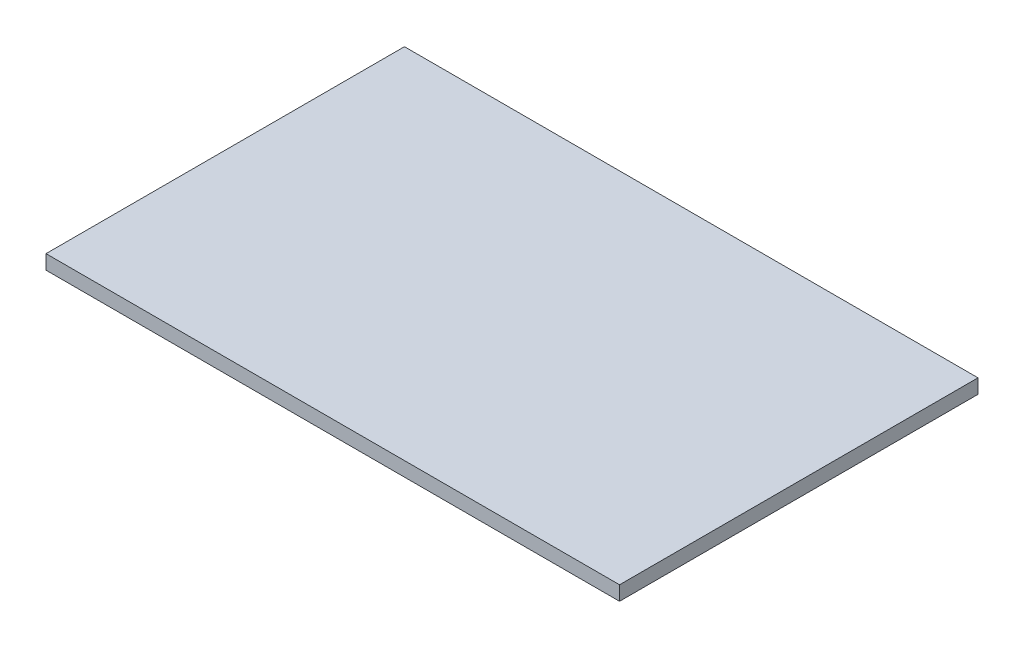
ISO-10303-21;
HEADER;
FILE_DESCRIPTION(('STEP AP214'),'2;1');
FILE_NAME('part.step','',(''),(''),'','','');
FILE_SCHEMA(('AUTOMOTIVE_DESIGN { 1 0 10303 214 1 1 1 1 }'));
ENDSEC;
DATA;
#1=APPLICATION_CONTEXT('core data for automotive mechanical design processes');
#2=APPLICATION_PROTOCOL_DEFINITION('international standard','automotive_design',2000,#1);
#3=PRODUCT_CONTEXT('',#1,'mechanical');
#4=PRODUCT('Part','Part','',(#3));
#5=PRODUCT_RELATED_PRODUCT_CATEGORY('part','',(#4));
#6=PRODUCT_DEFINITION_FORMATION('','',#4);
#7=PRODUCT_DEFINITION_CONTEXT('part definition',#1,'design');
#8=PRODUCT_DEFINITION('design','',#6,#7);
#9=PRODUCT_DEFINITION_SHAPE('','',#8);
#10=(LENGTH_UNIT() NAMED_UNIT(*) SI_UNIT(.MILLI.,.METRE.));
#11=(NAMED_UNIT(*) PLANE_ANGLE_UNIT() SI_UNIT($,.RADIAN.));
#12=(NAMED_UNIT(*) SI_UNIT($,.STERADIAN.) SOLID_ANGLE_UNIT());
#13=UNCERTAINTY_MEASURE_WITH_UNIT(LENGTH_MEASURE(1.E-05),#10,'distance_accuracy_value','');
#14=(GEOMETRIC_REPRESENTATION_CONTEXT(3) GLOBAL_UNCERTAINTY_ASSIGNED_CONTEXT((#13)) GLOBAL_UNIT_ASSIGNED_CONTEXT((#10,
#11,#12)) REPRESENTATION_CONTEXT('',''));
#15=CARTESIAN_POINT('',(0.,0.,0.));
#16=DIRECTION('',(0.,0.,1.));
#17=DIRECTION('',(1.,0.,0.));
#18=AXIS2_PLACEMENT_3D('',#15,#16,#17);
#19=CARTESIAN_POINT('',(0.,3.,0.));
#20=DIRECTION('',(1.,0.,0.));
#21=DIRECTION('',(0.,0.,-1.));
#22=AXIS2_PLACEMENT_3D('',#19,#20,#21);
#23=PLANE('',#22);
#24=DIRECTION('',(0.,0.,1.));
#25=VECTOR('',#24,1.);
#26=CARTESIAN_POINT('',(0.,0.,0.));
#27=LINE('',#26,#25);
#28=CARTESIAN_POINT('',(0.,0.,-75.));
#29=VERTEX_POINT('',#28);
#30=CARTESIAN_POINT('',(0.,0.,0.));
#31=VERTEX_POINT('',#30);
#32=EDGE_CURVE('E107',#29,#31,#27,.T.);
#33=ORIENTED_EDGE('',*,*,#32,.T.);
#34=DIRECTION('',(0.,-1.,0.));
#35=VECTOR('',#34,1.);
#36=CARTESIAN_POINT('',(0.,3.,0.));
#37=LINE('',#36,#35);
#38=CARTESIAN_POINT('',(0.,3.,0.));
#39=VERTEX_POINT('',#38);
#40=EDGE_CURVE('E11',#39,#31,#37,.T.);
#41=ORIENTED_EDGE('',*,*,#40,.F.);
#42=DIRECTION('',(0.,0.,1.));
#43=VECTOR('',#42,1.);
#44=CARTESIAN_POINT('',(0.,3.,0.));
#45=LINE('',#44,#43);
#46=CARTESIAN_POINT('',(0.,3.,-75.));
#47=VERTEX_POINT('',#46);
#48=EDGE_CURVE('E91',#47,#39,#45,.T.);
#49=ORIENTED_EDGE('',*,*,#48,.F.);
#50=DIRECTION('',(0.,-1.,0.));
#51=VECTOR('',#50,1.);
#52=CARTESIAN_POINT('',(0.,3.,-75.));
#53=LINE('',#52,#51);
#54=EDGE_CURVE('E103',#47,#29,#53,.T.);
#55=ORIENTED_EDGE('',*,*,#54,.T.);
#56=EDGE_LOOP('',(#33,#41,#49,#55));
#57=FACE_BOUND('',#56,.T.);
#58=ADVANCED_FACE('F39',(#57),#23,.F.);
#59=CARTESIAN_POINT('',(0.,3.,0.));
#60=DIRECTION('',(0.,0.,-1.));
#61=DIRECTION('',(-1.,0.,0.));
#62=AXIS2_PLACEMENT_3D('',#59,#60,#61);
#63=PLANE('',#62);
#64=DIRECTION('',(1.,0.,0.));
#65=VECTOR('',#64,1.);
#66=CARTESIAN_POINT('',(0.,0.,0.));
#67=LINE('',#66,#65);
#68=CARTESIAN_POINT('',(120.,0.,0.));
#69=VERTEX_POINT('',#68);
#70=EDGE_CURVE('E96',#31,#69,#67,.T.);
#71=ORIENTED_EDGE('',*,*,#70,.T.);
#72=DIRECTION('',(0.,-1.,0.));
#73=VECTOR('',#72,1.);
#74=CARTESIAN_POINT('',(120.,3.,0.));
#75=LINE('',#74,#73);
#76=CARTESIAN_POINT('',(120.,3.,0.));
#77=VERTEX_POINT('',#76);
#78=EDGE_CURVE('E48',#77,#69,#75,.T.);
#79=ORIENTED_EDGE('',*,*,#78,.F.);
#80=DIRECTION('',(1.,0.,0.));
#81=VECTOR('',#80,1.);
#82=CARTESIAN_POINT('',(0.,3.,0.));
#83=LINE('',#82,#81);
#84=EDGE_CURVE('E86',#39,#77,#83,.T.);
#85=ORIENTED_EDGE('',*,*,#84,.F.);
#86=ORIENTED_EDGE('',*,*,#40,.T.);
#87=EDGE_LOOP('',(#71,#79,#85,#86));
#88=FACE_BOUND('',#87,.T.);
#89=ADVANCED_FACE('F95',(#88),#63,.F.);
#90=CARTESIAN_POINT('',(120.,3.,0.));
#91=DIRECTION('',(-1.,0.,0.));
#92=DIRECTION('',(0.,0.,1.));
#93=AXIS2_PLACEMENT_3D('',#90,#91,#92);
#94=PLANE('',#93);
#95=DIRECTION('',(0.,0.,-1.));
#96=VECTOR('',#95,1.);
#97=CARTESIAN_POINT('',(120.,0.,0.));
#98=LINE('',#97,#96);
#99=CARTESIAN_POINT('',(120.,0.,-75.));
#100=VERTEX_POINT('',#99);
#101=EDGE_CURVE('E73',#69,#100,#98,.T.);
#102=ORIENTED_EDGE('',*,*,#101,.T.);
#103=DIRECTION('',(0.,-1.,0.));
#104=VECTOR('',#103,1.);
#105=CARTESIAN_POINT('',(120.,3.,-75.));
#106=LINE('',#105,#104);
#107=CARTESIAN_POINT('',(120.,3.,-75.));
#108=VERTEX_POINT('',#107);
#109=EDGE_CURVE('E98',#108,#100,#106,.T.);
#110=ORIENTED_EDGE('',*,*,#109,.F.);
#111=DIRECTION('',(0.,0.,-1.));
#112=VECTOR('',#111,1.);
#113=CARTESIAN_POINT('',(120.,3.,0.));
#114=LINE('',#113,#112);
#115=EDGE_CURVE('E89',#77,#108,#114,.T.);
#116=ORIENTED_EDGE('',*,*,#115,.F.);
#117=ORIENTED_EDGE('',*,*,#78,.T.);
#118=EDGE_LOOP('',(#102,#110,#116,#117));
#119=FACE_BOUND('',#118,.T.);
#120=ADVANCED_FACE('F99',(#119),#94,.F.);
#121=CARTESIAN_POINT('',(0.,3.,-75.));
#122=DIRECTION('',(0.,0.,1.));
#123=DIRECTION('',(1.,0.,0.));
#124=AXIS2_PLACEMENT_3D('',#121,#122,#123);
#125=PLANE('',#124);
#126=DIRECTION('',(-1.,0.,0.));
#127=VECTOR('',#126,1.);
#128=CARTESIAN_POINT('',(0.,0.,-75.));
#129=LINE('',#128,#127);
#130=EDGE_CURVE('E79',#100,#29,#129,.T.);
#131=ORIENTED_EDGE('',*,*,#130,.T.);
#132=ORIENTED_EDGE('',*,*,#54,.F.);
#133=DIRECTION('',(-1.,0.,0.));
#134=VECTOR('',#133,1.);
#135=CARTESIAN_POINT('',(0.,3.,-75.));
#136=LINE('',#135,#134);
#137=EDGE_CURVE('E56',#108,#47,#136,.T.);
#138=ORIENTED_EDGE('',*,*,#137,.F.);
#139=ORIENTED_EDGE('',*,*,#109,.T.);
#140=EDGE_LOOP('',(#131,#132,#138,#139));
#141=FACE_BOUND('',#140,.T.);
#142=ADVANCED_FACE('F120',(#141),#125,.F.);
#143=CARTESIAN_POINT('',(0.,3.,0.));
#144=DIRECTION('',(0.,-1.,0.));
#145=DIRECTION('',(0.,0.,-1.));
#146=AXIS2_PLACEMENT_3D('',#143,#144,#145);
#147=PLANE('',#146);
#148=ORIENTED_EDGE('',*,*,#48,.T.);
#149=ORIENTED_EDGE('',*,*,#84,.T.);
#150=ORIENTED_EDGE('',*,*,#115,.T.);
#151=ORIENTED_EDGE('',*,*,#137,.T.);
#152=EDGE_LOOP('',(#148,#149,#150,#151));
#153=FACE_BOUND('',#152,.T.);
#154=ADVANCED_FACE('F87',(#153),#147,.F.);
#155=CARTESIAN_POINT('',(0.,0.,0.));
#156=DIRECTION('',(0.,-1.,0.));
#157=DIRECTION('',(0.,0.,-1.));
#158=AXIS2_PLACEMENT_3D('',#155,#156,#157);
#159=PLANE('',#158);
#160=ORIENTED_EDGE('',*,*,#32,.F.);
#161=ORIENTED_EDGE('',*,*,#130,.F.);
#162=ORIENTED_EDGE('',*,*,#101,.F.);
#163=ORIENTED_EDGE('',*,*,#70,.F.);
#164=EDGE_LOOP('',(#160,#161,#162,#163));
#165=FACE_BOUND('',#164,.T.);
#166=ADVANCED_FACE('F123',(#165),#159,.T.);
#167=CLOSED_SHELL('',(#58,#89,#120,#142,#154,#166));
#168=MANIFOLD_SOLID_BREP('B2',#167);
#169=ADVANCED_BREP_SHAPE_REPRESENTATION('',(#18,#168),#14);
#170=SHAPE_DEFINITION_REPRESENTATION(#9,#169);
ENDSEC;
END-ISO-10303-21;
